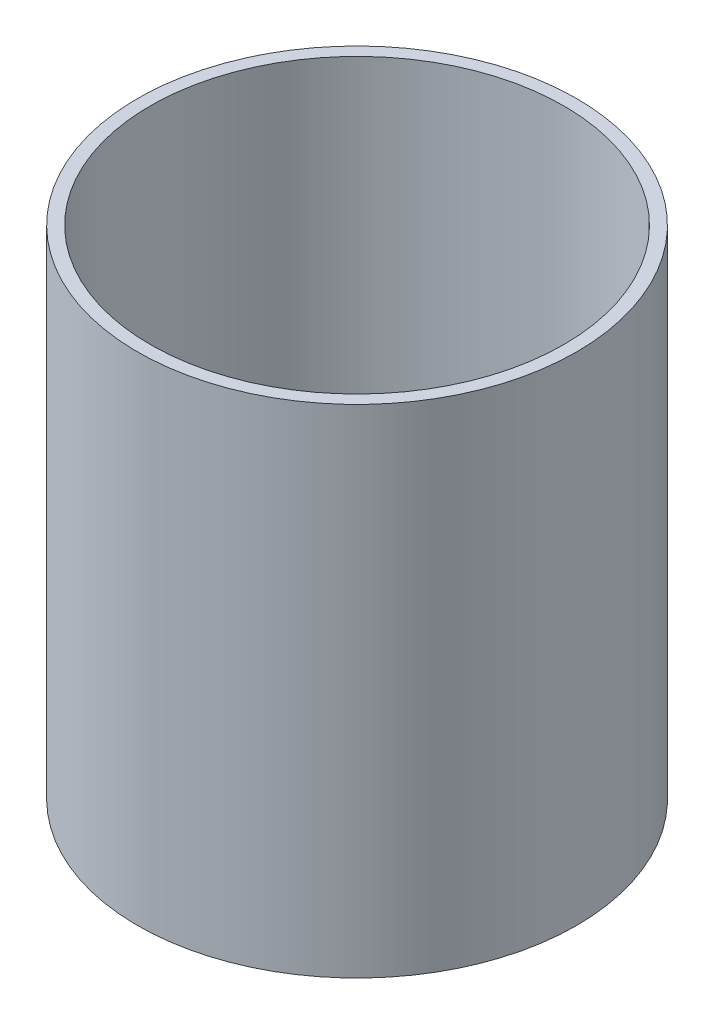
ISO-10303-21;
HEADER;
FILE_DESCRIPTION(('STEP AP214'),'2;1');
FILE_NAME('part.step','',(''),(''),'','','');
FILE_SCHEMA(('AUTOMOTIVE_DESIGN { 1 0 10303 214 1 1 1 1 }'));
ENDSEC;
DATA;
#1=APPLICATION_CONTEXT('core data for automotive mechanical design processes');
#2=APPLICATION_PROTOCOL_DEFINITION('international standard','automotive_design',2000,#1);
#3=PRODUCT_CONTEXT('',#1,'mechanical');
#4=PRODUCT('Part','Part','',(#3));
#5=PRODUCT_RELATED_PRODUCT_CATEGORY('part','',(#4));
#6=PRODUCT_DEFINITION_FORMATION('','',#4);
#7=PRODUCT_DEFINITION_CONTEXT('part definition',#1,'design');
#8=PRODUCT_DEFINITION('design','',#6,#7);
#9=PRODUCT_DEFINITION_SHAPE('','',#8);
#10=(LENGTH_UNIT() NAMED_UNIT(*) SI_UNIT(.MILLI.,.METRE.));
#11=(NAMED_UNIT(*) PLANE_ANGLE_UNIT() SI_UNIT($,.RADIAN.));
#12=(NAMED_UNIT(*) SI_UNIT($,.STERADIAN.) SOLID_ANGLE_UNIT());
#13=UNCERTAINTY_MEASURE_WITH_UNIT(LENGTH_MEASURE(1.E-05),#10,'distance_accuracy_value','');
#14=(GEOMETRIC_REPRESENTATION_CONTEXT(3) GLOBAL_UNCERTAINTY_ASSIGNED_CONTEXT((#13)) GLOBAL_UNIT_ASSIGNED_CONTEXT((#10,
#11,#12)) REPRESENTATION_CONTEXT('',''));
#15=CARTESIAN_POINT('',(0.,0.,0.));
#16=DIRECTION('',(0.,0.,1.));
#17=DIRECTION('',(1.,0.,0.));
#18=AXIS2_PLACEMENT_3D('',#15,#16,#17);
#19=CARTESIAN_POINT('',(103.1875,549.275,0.));
#20=DIRECTION('',(0.,-1.,0.));
#21=DIRECTION('',(1.,0.,0.));
#22=AXIS2_PLACEMENT_3D('',#19,#20,#21);
#23=PLANE('',#22);
#24=CARTESIAN_POINT('',(0.,549.275,0.));
#25=DIRECTION('',(0.,-1.,0.));
#26=DIRECTION('',(1.,0.,0.));
#27=AXIS2_PLACEMENT_3D('',#24,#25,#26);
#28=CIRCLE('',#27,109.5375);
#29=CARTESIAN_POINT('',(109.5375,549.275,0.));
#30=VERTEX_POINT('',#29);
#31=EDGE_CURVE('E10',#30,#30,#28,.T.);
#32=ORIENTED_EDGE('',*,*,#31,.T.);
#33=EDGE_LOOP('',(#32));
#34=FACE_BOUND('',#33,.T.);
#35=CARTESIAN_POINT('',(0.,549.275,0.));
#36=DIRECTION('',(0.,-1.,0.));
#37=DIRECTION('',(1.,0.,0.));
#38=AXIS2_PLACEMENT_3D('',#35,#36,#37);
#39=CIRCLE('',#38,103.1875);
#40=CARTESIAN_POINT('',(103.1875,549.275,0.));
#41=VERTEX_POINT('',#40);
#42=EDGE_CURVE('E47',#41,#41,#39,.T.);
#43=ORIENTED_EDGE('',*,*,#42,.F.);
#44=EDGE_LOOP('',(#43));
#45=FACE_BOUND('',#44,.T.);
#46=ADVANCED_FACE('F33',(#34,#45),#23,.T.);
#47=CARTESIAN_POINT('',(0.,0.,0.));
#48=DIRECTION('',(0.,-1.,0.));
#49=DIRECTION('',(1.,0.,0.));
#50=AXIS2_PLACEMENT_3D('',#47,#48,#49);
#51=CYLINDRICAL_SURFACE('',#50,109.5375);
#52=CARTESIAN_POINT('',(0.,797.179,0.));
#53=DIRECTION('',(0.,-1.,0.));
#54=DIRECTION('',(1.,0.,0.));
#55=AXIS2_PLACEMENT_3D('',#52,#53,#54);
#56=CIRCLE('',#55,109.5375);
#57=CARTESIAN_POINT('',(109.5375,797.179,0.));
#58=VERTEX_POINT('',#57);
#59=EDGE_CURVE('E39',#58,#58,#56,.T.);
#60=ORIENTED_EDGE('',*,*,#59,.T.);
#61=EDGE_LOOP('',(#60));
#62=FACE_BOUND('',#61,.T.);
#63=ORIENTED_EDGE('',*,*,#31,.F.);
#64=EDGE_LOOP('',(#63));
#65=FACE_BOUND('',#64,.T.);
#66=ADVANCED_FACE('F57',(#62,#65),#51,.T.);
#67=CARTESIAN_POINT('',(103.1875,797.179,0.));
#68=DIRECTION('',(0.,1.,0.));
#69=DIRECTION('',(-1.,0.,0.));
#70=AXIS2_PLACEMENT_3D('',#67,#68,#69);
#71=PLANE('',#70);
#72=CARTESIAN_POINT('',(0.,797.179,0.));
#73=DIRECTION('',(0.,-1.,0.));
#74=DIRECTION('',(1.,0.,0.));
#75=AXIS2_PLACEMENT_3D('',#72,#73,#74);
#76=CIRCLE('',#75,103.1875);
#77=CARTESIAN_POINT('',(103.1875,797.179,0.));
#78=VERTEX_POINT('',#77);
#79=EDGE_CURVE('E43',#78,#78,#76,.T.);
#80=ORIENTED_EDGE('',*,*,#79,.T.);
#81=EDGE_LOOP('',(#80));
#82=FACE_BOUND('',#81,.T.);
#83=ORIENTED_EDGE('',*,*,#59,.F.);
#84=EDGE_LOOP('',(#83));
#85=FACE_BOUND('',#84,.T.);
#86=ADVANCED_FACE('F61',(#82,#85),#71,.T.);
#87=CARTESIAN_POINT('',(0.,0.,0.));
#88=DIRECTION('',(0.,-1.,0.));
#89=DIRECTION('',(1.,0.,0.));
#90=AXIS2_PLACEMENT_3D('',#87,#88,#89);
#91=CYLINDRICAL_SURFACE('',#90,103.1875);
#92=ORIENTED_EDGE('',*,*,#42,.T.);
#93=EDGE_LOOP('',(#92));
#94=FACE_BOUND('',#93,.T.);
#95=ORIENTED_EDGE('',*,*,#79,.F.);
#96=EDGE_LOOP('',(#95));
#97=FACE_BOUND('',#96,.T.);
#98=ADVANCED_FACE('F53',(#94,#97),#91,.F.);
#99=CLOSED_SHELL('',(#46,#66,#86,#98));
#100=MANIFOLD_SOLID_BREP('B2',#99);
#101=ADVANCED_BREP_SHAPE_REPRESENTATION('',(#18,#100),#14);
#102=SHAPE_DEFINITION_REPRESENTATION(#9,#101);
ENDSEC;
END-ISO-10303-21;
